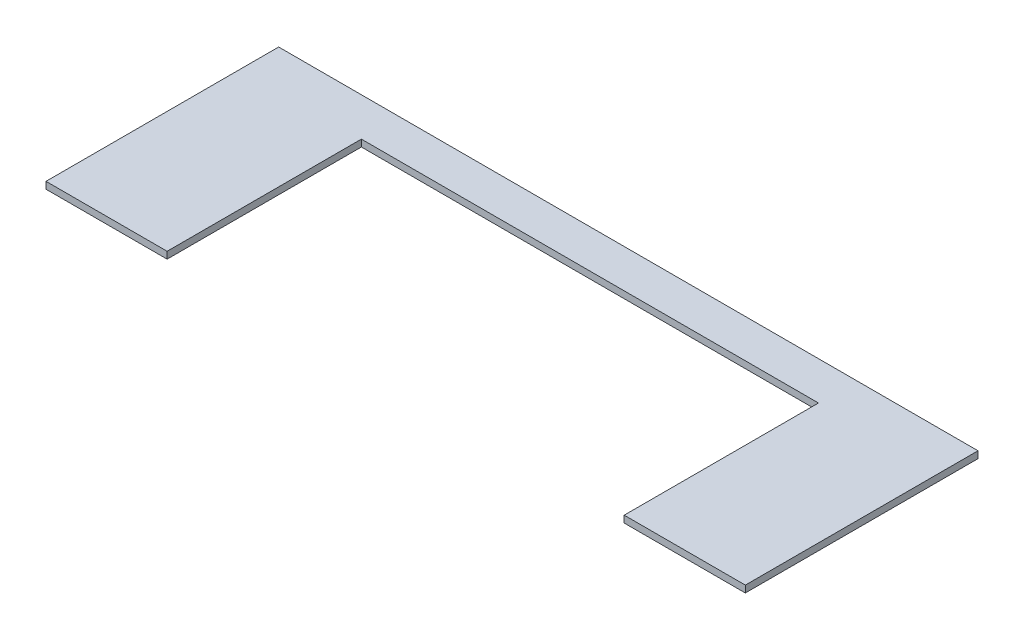
ISO-10303-21;
HEADER;
FILE_DESCRIPTION(('STEP AP214'),'2;1');
FILE_NAME('part.step','',(''),(''),'','','');
FILE_SCHEMA(('AUTOMOTIVE_DESIGN { 1 0 10303 214 1 1 1 1 }'));
ENDSEC;
DATA;
#1=APPLICATION_CONTEXT('core data for automotive mechanical design processes');
#2=APPLICATION_PROTOCOL_DEFINITION('international standard','automotive_design',2000,#1);
#3=PRODUCT_CONTEXT('',#1,'mechanical');
#4=PRODUCT('Part','Part','',(#3));
#5=PRODUCT_RELATED_PRODUCT_CATEGORY('part','',(#4));
#6=PRODUCT_DEFINITION_FORMATION('','',#4);
#7=PRODUCT_DEFINITION_CONTEXT('part definition',#1,'design');
#8=PRODUCT_DEFINITION('design','',#6,#7);
#9=PRODUCT_DEFINITION_SHAPE('','',#8);
#10=(LENGTH_UNIT() NAMED_UNIT(*) SI_UNIT(.MILLI.,.METRE.));
#11=(NAMED_UNIT(*) PLANE_ANGLE_UNIT() SI_UNIT($,.RADIAN.));
#12=(NAMED_UNIT(*) SI_UNIT($,.STERADIAN.) SOLID_ANGLE_UNIT());
#13=UNCERTAINTY_MEASURE_WITH_UNIT(LENGTH_MEASURE(1.E-05),#10,'distance_accuracy_value','');
#14=(GEOMETRIC_REPRESENTATION_CONTEXT(3) GLOBAL_UNCERTAINTY_ASSIGNED_CONTEXT((#13)) GLOBAL_UNIT_ASSIGNED_CONTEXT((#10,
#11,#12)) REPRESENTATION_CONTEXT('',''));
#15=CARTESIAN_POINT('',(0.,0.,0.));
#16=DIRECTION('',(0.,0.,1.));
#17=DIRECTION('',(1.,0.,0.));
#18=AXIS2_PLACEMENT_3D('',#15,#16,#17);
#19=CARTESIAN_POINT('',(1967.06122894345,6.,-1870.89707036727));
#20=DIRECTION('',(0.,0.,-1.));
#21=DIRECTION('',(-1.,0.,0.));
#22=AXIS2_PLACEMENT_3D('',#19,#20,#21);
#23=PLANE('',#22);
#24=DIRECTION('',(1.,0.,0.));
#25=VECTOR('',#24,1.);
#26=CARTESIAN_POINT('',(1967.06122894345,0.,-1870.89707036727));
#27=LINE('',#26,#25);
#28=CARTESIAN_POINT('',(1967.06122894345,0.,-1870.89707036727));
#29=VERTEX_POINT('',#28);
#30=CARTESIAN_POINT('',(2073.06122894345,0.,-1870.89707036727));
#31=VERTEX_POINT('',#30);
#32=EDGE_CURVE('E120',#29,#31,#27,.T.);
#33=ORIENTED_EDGE('',*,*,#32,.T.);
#34=DIRECTION('',(0.,1.,0.));
#35=VECTOR('',#34,1.);
#36=CARTESIAN_POINT('',(2073.06122894345,-434.626276242015,-1870.89707036727));
#37=LINE('',#36,#35);
#38=CARTESIAN_POINT('',(2073.06122894345,6.,-1870.89707036727));
#39=VERTEX_POINT('',#38);
#40=EDGE_CURVE('E111',#31,#39,#37,.T.);
#41=ORIENTED_EDGE('',*,*,#40,.T.);
#42=DIRECTION('',(1.,0.,0.));
#43=VECTOR('',#42,1.);
#44=CARTESIAN_POINT('',(1967.06122894345,6.,-1870.89707036727));
#45=LINE('',#44,#43);
#46=CARTESIAN_POINT('',(1967.06122894345,6.,-1870.89707036727));
#47=VERTEX_POINT('',#46);
#48=EDGE_CURVE('E87',#47,#39,#45,.T.);
#49=ORIENTED_EDGE('',*,*,#48,.F.);
#50=DIRECTION('',(0.,-1.,0.));
#51=VECTOR('',#50,1.);
#52=CARTESIAN_POINT('',(1967.06122894345,6.,-1870.89707036727));
#53=LINE('',#52,#51);
#54=EDGE_CURVE('E11',#47,#29,#53,.T.);
#55=ORIENTED_EDGE('',*,*,#54,.T.);
#56=EDGE_LOOP('',(#33,#41,#49,#55));
#57=FACE_BOUND('',#56,.T.);
#58=ADVANCED_FACE('F35',(#57),#23,.F.);
#59=CARTESIAN_POINT('',(1967.06122894345,6.,-2074.50430396369));
#60=DIRECTION('',(1.,0.,0.));
#61=DIRECTION('',(0.,0.,-1.));
#62=AXIS2_PLACEMENT_3D('',#59,#60,#61);
#63=PLANE('',#62);
#64=DIRECTION('',(0.,0.,1.));
#65=VECTOR('',#64,1.);
#66=CARTESIAN_POINT('',(1967.06122894345,0.,-2074.50430396369));
#67=LINE('',#66,#65);
#68=CARTESIAN_POINT('',(1967.06122894345,0.,-2074.50430396369));
#69=VERTEX_POINT('',#68);
#70=EDGE_CURVE('E136',#69,#29,#67,.T.);
#71=ORIENTED_EDGE('',*,*,#70,.T.);
#72=ORIENTED_EDGE('',*,*,#54,.F.);
#73=DIRECTION('',(0.,0.,1.));
#74=VECTOR('',#73,1.);
#75=CARTESIAN_POINT('',(1967.06122894345,6.,-2074.50430396369));
#76=LINE('',#75,#74);
#77=CARTESIAN_POINT('',(1967.06122894345,6.,-2074.50430396369));
#78=VERTEX_POINT('',#77);
#79=EDGE_CURVE('E126',#78,#47,#76,.T.);
#80=ORIENTED_EDGE('',*,*,#79,.F.);
#81=DIRECTION('',(0.,-1.,0.));
#82=VECTOR('',#81,1.);
#83=CARTESIAN_POINT('',(1967.06122894345,6.,-2074.50430396369));
#84=LINE('',#83,#82);
#85=EDGE_CURVE('E135',#78,#69,#84,.T.);
#86=ORIENTED_EDGE('',*,*,#85,.T.);
#87=EDGE_LOOP('',(#71,#72,#80,#86));
#88=FACE_BOUND('',#87,.T.);
#89=ADVANCED_FACE('F37',(#88),#63,.F.);
#90=CARTESIAN_POINT('',(2473.06122894345,6.,-1870.89707036727));
#91=VERTEX_POINT('',#90);
#92=CARTESIAN_POINT('',(2579.06122894345,6.,-1870.89707036727));
#93=VERTEX_POINT('',#92);
#94=EDGE_CURVE('E129',#91,#93,#45,.T.);
#95=ORIENTED_EDGE('',*,*,#94,.F.);
#96=DIRECTION('',(0.,1.,0.));
#97=VECTOR('',#96,1.);
#98=CARTESIAN_POINT('',(2473.06122894345,-434.626276242015,-1870.89707036727));
#99=LINE('',#98,#97);
#100=CARTESIAN_POINT('',(2473.06122894345,0.,-1870.89707036727));
#101=VERTEX_POINT('',#100);
#102=EDGE_CURVE('E121',#101,#91,#99,.T.);
#103=ORIENTED_EDGE('',*,*,#102,.F.);
#104=CARTESIAN_POINT('',(2579.06122894345,0.,-1870.89707036727));
#105=VERTEX_POINT('',#104);
#106=EDGE_CURVE('E139',#101,#105,#27,.T.);
#107=ORIENTED_EDGE('',*,*,#106,.T.);
#108=DIRECTION('',(0.,-1.,0.));
#109=VECTOR('',#108,1.);
#110=CARTESIAN_POINT('',(2579.06122894345,6.,-1870.89707036727));
#111=LINE('',#110,#109);
#112=EDGE_CURVE('E43',#93,#105,#111,.T.);
#113=ORIENTED_EDGE('',*,*,#112,.F.);
#114=EDGE_LOOP('',(#95,#103,#107,#113));
#115=FACE_BOUND('',#114,.T.);
#116=ADVANCED_FACE('F171',(#115),#23,.F.);
#117=CARTESIAN_POINT('',(2579.06122894345,6.,-2074.50430396369));
#118=DIRECTION('',(-1.,0.,0.));
#119=DIRECTION('',(0.,0.,1.));
#120=AXIS2_PLACEMENT_3D('',#117,#118,#119);
#121=PLANE('',#120);
#122=DIRECTION('',(0.,0.,-1.));
#123=VECTOR('',#122,1.);
#124=CARTESIAN_POINT('',(2579.06122894345,0.,-2074.50430396369));
#125=LINE('',#124,#123);
#126=CARTESIAN_POINT('',(2579.06122894345,0.,-2074.50430396369));
#127=VERTEX_POINT('',#126);
#128=EDGE_CURVE('E142',#105,#127,#125,.T.);
#129=ORIENTED_EDGE('',*,*,#128,.T.);
#130=DIRECTION('',(0.,-1.,0.));
#131=VECTOR('',#130,1.);
#132=CARTESIAN_POINT('',(2579.06122894345,6.,-2074.50430396369));
#133=LINE('',#132,#131);
#134=CARTESIAN_POINT('',(2579.06122894345,6.,-2074.50430396369));
#135=VERTEX_POINT('',#134);
#136=EDGE_CURVE('E146',#135,#127,#133,.T.);
#137=ORIENTED_EDGE('',*,*,#136,.F.);
#138=DIRECTION('',(0.,0.,-1.));
#139=VECTOR('',#138,1.);
#140=CARTESIAN_POINT('',(2579.06122894345,6.,-2074.50430396369));
#141=LINE('',#140,#139);
#142=EDGE_CURVE('E128',#93,#135,#141,.T.);
#143=ORIENTED_EDGE('',*,*,#142,.F.);
#144=ORIENTED_EDGE('',*,*,#112,.T.);
#145=EDGE_LOOP('',(#129,#137,#143,#144));
#146=FACE_BOUND('',#145,.T.);
#147=ADVANCED_FACE('F152',(#146),#121,.F.);
#148=CARTESIAN_POINT('',(1967.06122894345,6.,-2074.50430396369));
#149=DIRECTION('',(0.,0.,1.));
#150=DIRECTION('',(1.,0.,0.));
#151=AXIS2_PLACEMENT_3D('',#148,#149,#150);
#152=PLANE('',#151);
#153=DIRECTION('',(-1.,0.,0.));
#154=VECTOR('',#153,1.);
#155=CARTESIAN_POINT('',(1967.06122894345,0.,-2074.50430396369));
#156=LINE('',#155,#154);
#157=EDGE_CURVE('E80',#127,#69,#156,.T.);
#158=ORIENTED_EDGE('',*,*,#157,.T.);
#159=ORIENTED_EDGE('',*,*,#85,.F.);
#160=DIRECTION('',(-1.,0.,0.));
#161=VECTOR('',#160,1.);
#162=CARTESIAN_POINT('',(1967.06122894345,6.,-2074.50430396369));
#163=LINE('',#162,#161);
#164=EDGE_CURVE('E59',#135,#78,#163,.T.);
#165=ORIENTED_EDGE('',*,*,#164,.F.);
#166=ORIENTED_EDGE('',*,*,#136,.T.);
#167=EDGE_LOOP('',(#158,#159,#165,#166));
#168=FACE_BOUND('',#167,.T.);
#169=ADVANCED_FACE('F163',(#168),#152,.F.);
#170=CARTESIAN_POINT('',(0.,6.,0.));
#171=DIRECTION('',(0.,1.,0.));
#172=DIRECTION('',(0.,0.,1.));
#173=AXIS2_PLACEMENT_3D('',#170,#171,#172);
#174=PLANE('',#173);
#175=DIRECTION('',(0.,0.,1.));
#176=VECTOR('',#175,1.);
#177=CARTESIAN_POINT('',(2073.06122894345,6.,-1870.89707036727));
#178=LINE('',#177,#176);
#179=CARTESIAN_POINT('',(2073.06122894345,6.,-2040.89707036727));
#180=VERTEX_POINT('',#179);
#181=EDGE_CURVE('E109',#180,#39,#178,.T.);
#182=ORIENTED_EDGE('',*,*,#181,.F.);
#183=DIRECTION('',(-1.,0.,0.));
#184=VECTOR('',#183,1.);
#185=CARTESIAN_POINT('',(2073.06122894345,6.,-2040.89707036727));
#186=LINE('',#185,#184);
#187=CARTESIAN_POINT('',(2473.06122894345,6.,-2040.89707036727));
#188=VERTEX_POINT('',#187);
#189=EDGE_CURVE('E122',#188,#180,#186,.T.);
#190=ORIENTED_EDGE('',*,*,#189,.F.);
#191=DIRECTION('',(0.,0.,-1.));
#192=VECTOR('',#191,1.);
#193=CARTESIAN_POINT('',(2473.06122894345,6.,-1870.89707036727));
#194=LINE('',#193,#192);
#195=EDGE_CURVE('E117',#91,#188,#194,.T.);
#196=ORIENTED_EDGE('',*,*,#195,.F.);
#197=ORIENTED_EDGE('',*,*,#94,.T.);
#198=ORIENTED_EDGE('',*,*,#142,.T.);
#199=ORIENTED_EDGE('',*,*,#164,.T.);
#200=ORIENTED_EDGE('',*,*,#79,.T.);
#201=ORIENTED_EDGE('',*,*,#48,.T.);
#202=EDGE_LOOP('',(#182,#190,#196,#197,#198,#199,#200,#201));
#203=FACE_BOUND('',#202,.T.);
#204=ADVANCED_FACE('F124',(#203),#174,.T.);
#205=CARTESIAN_POINT('',(0.,0.,0.));
#206=DIRECTION('',(0.,1.,0.));
#207=DIRECTION('',(0.,0.,1.));
#208=AXIS2_PLACEMENT_3D('',#205,#206,#207);
#209=PLANE('',#208);
#210=DIRECTION('',(1.,0.,0.));
#211=VECTOR('',#210,1.);
#212=CARTESIAN_POINT('',(2073.06122894345,0.,-2040.89707036727));
#213=LINE('',#212,#211);
#214=CARTESIAN_POINT('',(2073.06122894345,0.,-2040.89707036727));
#215=VERTEX_POINT('',#214);
#216=CARTESIAN_POINT('',(2473.06122894345,0.,-2040.89707036727));
#217=VERTEX_POINT('',#216);
#218=EDGE_CURVE('E191',#215,#217,#213,.T.);
#219=ORIENTED_EDGE('',*,*,#218,.F.);
#220=DIRECTION('',(0.,0.,-1.));
#221=VECTOR('',#220,1.);
#222=CARTESIAN_POINT('',(2073.06122894345,0.,-1870.89707036727));
#223=LINE('',#222,#221);
#224=EDGE_CURVE('E140',#31,#215,#223,.T.);
#225=ORIENTED_EDGE('',*,*,#224,.F.);
#226=ORIENTED_EDGE('',*,*,#32,.F.);
#227=ORIENTED_EDGE('',*,*,#70,.F.);
#228=ORIENTED_EDGE('',*,*,#157,.F.);
#229=ORIENTED_EDGE('',*,*,#128,.F.);
#230=ORIENTED_EDGE('',*,*,#106,.F.);
#231=DIRECTION('',(0.,0.,1.));
#232=VECTOR('',#231,1.);
#233=CARTESIAN_POINT('',(2473.06122894345,0.,-1870.89707036727));
#234=LINE('',#233,#232);
#235=EDGE_CURVE('E188',#217,#101,#234,.T.);
#236=ORIENTED_EDGE('',*,*,#235,.F.);
#237=EDGE_LOOP('',(#219,#225,#226,#227,#228,#229,#230,#236));
#238=FACE_BOUND('',#237,.T.);
#239=ADVANCED_FACE('F159',(#238),#209,.F.);
#240=CARTESIAN_POINT('',(2073.06122894345,-434.626276242015,-1870.89707036727));
#241=DIRECTION('',(-1.,0.,0.));
#242=DIRECTION('',(0.,0.,1.));
#243=AXIS2_PLACEMENT_3D('',#240,#241,#242);
#244=PLANE('',#243);
#245=ORIENTED_EDGE('',*,*,#224,.T.);
#246=DIRECTION('',(0.,1.,0.));
#247=VECTOR('',#246,1.);
#248=CARTESIAN_POINT('',(2073.06122894345,-434.626276242015,-2040.89707036727));
#249=LINE('',#248,#247);
#250=EDGE_CURVE('E114',#215,#180,#249,.T.);
#251=ORIENTED_EDGE('',*,*,#250,.T.);
#252=ORIENTED_EDGE('',*,*,#181,.T.);
#253=ORIENTED_EDGE('',*,*,#40,.F.);
#254=EDGE_LOOP('',(#245,#251,#252,#253));
#255=FACE_BOUND('',#254,.T.);
#256=ADVANCED_FACE('F110',(#255),#244,.F.);
#257=CARTESIAN_POINT('',(2073.06122894345,-434.626276242015,-2040.89707036727));
#258=DIRECTION('',(0.,0.,-1.));
#259=DIRECTION('',(-1.,0.,0.));
#260=AXIS2_PLACEMENT_3D('',#257,#258,#259);
#261=PLANE('',#260);
#262=ORIENTED_EDGE('',*,*,#218,.T.);
#263=DIRECTION('',(0.,1.,0.));
#264=VECTOR('',#263,1.);
#265=CARTESIAN_POINT('',(2473.06122894345,-434.626276242015,-2040.89707036727));
#266=LINE('',#265,#264);
#267=EDGE_CURVE('E50',#217,#188,#266,.T.);
#268=ORIENTED_EDGE('',*,*,#267,.T.);
#269=ORIENTED_EDGE('',*,*,#189,.T.);
#270=ORIENTED_EDGE('',*,*,#250,.F.);
#271=EDGE_LOOP('',(#262,#268,#269,#270));
#272=FACE_BOUND('',#271,.T.);
#273=ADVANCED_FACE('F195',(#272),#261,.F.);
#274=CARTESIAN_POINT('',(2473.06122894345,-434.626276242015,-1870.89707036727));
#275=DIRECTION('',(1.,0.,0.));
#276=DIRECTION('',(0.,0.,-1.));
#277=AXIS2_PLACEMENT_3D('',#274,#275,#276);
#278=PLANE('',#277);
#279=ORIENTED_EDGE('',*,*,#235,.T.);
#280=ORIENTED_EDGE('',*,*,#102,.T.);
#281=ORIENTED_EDGE('',*,*,#195,.T.);
#282=ORIENTED_EDGE('',*,*,#267,.F.);
#283=EDGE_LOOP('',(#279,#280,#281,#282));
#284=FACE_BOUND('',#283,.T.);
#285=ADVANCED_FACE('F190',(#284),#278,.F.);
#286=CLOSED_SHELL('',(#58,#89,#116,#147,#169,#204,#239,#256,#273,#285));
#287=MANIFOLD_SOLID_BREP('B2',#286);
#288=ADVANCED_BREP_SHAPE_REPRESENTATION('',(#18,#287),#14);
#289=SHAPE_DEFINITION_REPRESENTATION(#9,#288);
ENDSEC;
END-ISO-10303-21;
